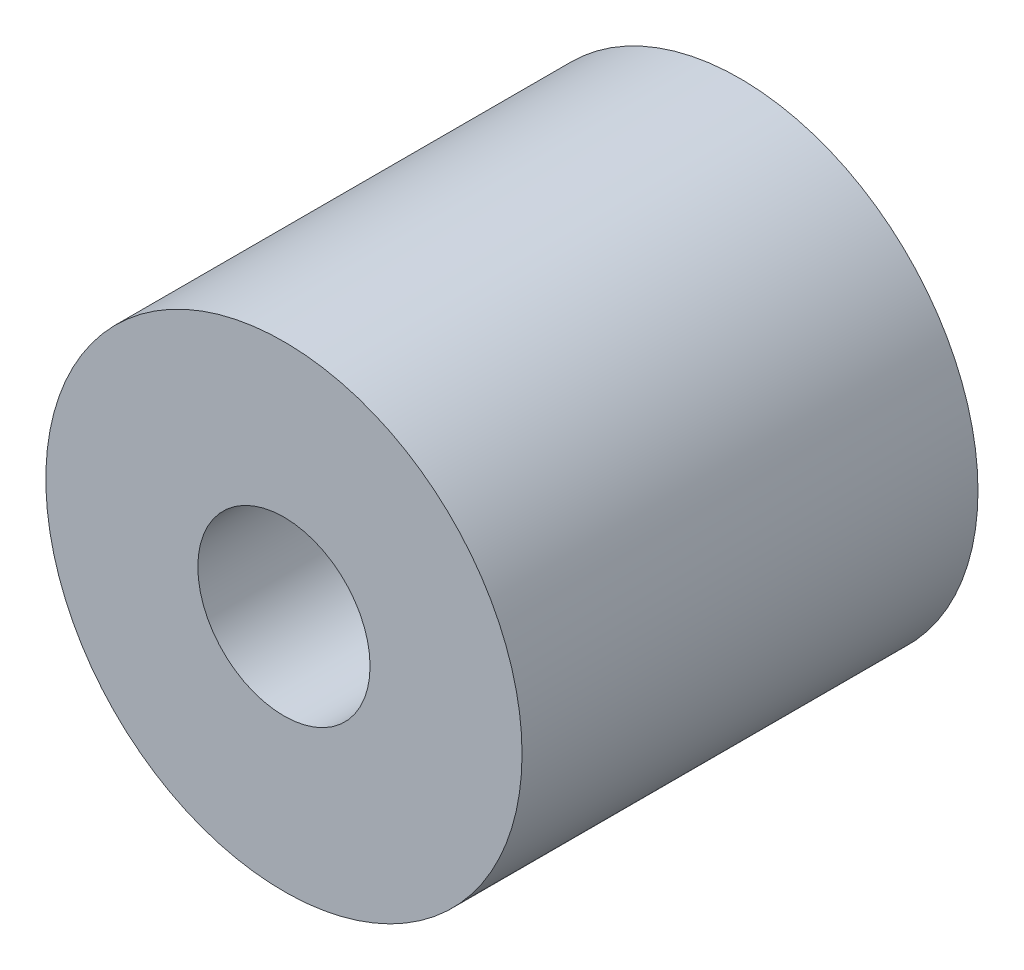
ISO-10303-21;
HEADER;
FILE_DESCRIPTION(('STEP AP214'),'2;1');
FILE_NAME('part.step','',(''),(''),'','','');
FILE_SCHEMA(('AUTOMOTIVE_DESIGN { 1 0 10303 214 1 1 1 1 }'));
ENDSEC;
DATA;
#1=APPLICATION_CONTEXT('core data for automotive mechanical design processes');
#2=APPLICATION_PROTOCOL_DEFINITION('international standard','automotive_design',2000,#1);
#3=PRODUCT_CONTEXT('',#1,'mechanical');
#4=PRODUCT('Part','Part','',(#3));
#5=PRODUCT_RELATED_PRODUCT_CATEGORY('part','',(#4));
#6=PRODUCT_DEFINITION_FORMATION('','',#4);
#7=PRODUCT_DEFINITION_CONTEXT('part definition',#1,'design');
#8=PRODUCT_DEFINITION('design','',#6,#7);
#9=PRODUCT_DEFINITION_SHAPE('','',#8);
#10=(LENGTH_UNIT() NAMED_UNIT(*) SI_UNIT(.MILLI.,.METRE.));
#11=(NAMED_UNIT(*) PLANE_ANGLE_UNIT() SI_UNIT($,.RADIAN.));
#12=(NAMED_UNIT(*) SI_UNIT($,.STERADIAN.) SOLID_ANGLE_UNIT());
#13=UNCERTAINTY_MEASURE_WITH_UNIT(LENGTH_MEASURE(1.E-05),#10,'distance_accuracy_value','');
#14=(GEOMETRIC_REPRESENTATION_CONTEXT(3) GLOBAL_UNCERTAINTY_ASSIGNED_CONTEXT((#13)) GLOBAL_UNIT_ASSIGNED_CONTEXT((#10,
#11,#12)) REPRESENTATION_CONTEXT('',''));
#15=CARTESIAN_POINT('',(0.,0.,0.));
#16=DIRECTION('',(0.,0.,1.));
#17=DIRECTION('',(1.,0.,0.));
#18=AXIS2_PLACEMENT_3D('',#15,#16,#17);
#19=CARTESIAN_POINT('',(0.,0.,9.));
#20=DIRECTION('',(0.,0.,1.));
#21=DIRECTION('',(1.,0.,0.));
#22=AXIS2_PLACEMENT_3D('',#19,#20,#21);
#23=PLANE('',#22);
#24=CARTESIAN_POINT('',(0.,0.,9.));
#25=DIRECTION('',(0.,0.,1.));
#26=DIRECTION('',(1.,0.,0.));
#27=AXIS2_PLACEMENT_3D('',#24,#25,#26);
#28=CIRCLE('',#27,4.7);
#29=CARTESIAN_POINT('',(4.7,0.,9.));
#30=VERTEX_POINT('',#29);
#31=EDGE_CURVE('E10',#30,#30,#28,.T.);
#32=ORIENTED_EDGE('',*,*,#31,.T.);
#33=EDGE_LOOP('',(#32));
#34=FACE_BOUND('',#33,.T.);
#35=CARTESIAN_POINT('',(0.,0.,9.));
#36=DIRECTION('',(0.,0.,1.));
#37=DIRECTION('',(1.,0.,0.));
#38=AXIS2_PLACEMENT_3D('',#35,#36,#37);
#39=CIRCLE('',#38,1.7);
#40=CARTESIAN_POINT('',(1.7,0.,9.));
#41=VERTEX_POINT('',#40);
#42=EDGE_CURVE('E50',#41,#41,#39,.T.);
#43=ORIENTED_EDGE('',*,*,#42,.F.);
#44=EDGE_LOOP('',(#43));
#45=FACE_BOUND('',#44,.T.);
#46=ADVANCED_FACE('F37',(#34,#45),#23,.T.);
#47=CARTESIAN_POINT('',(0.,0.,0.));
#48=DIRECTION('',(0.,0.,1.));
#49=DIRECTION('',(1.,0.,0.));
#50=AXIS2_PLACEMENT_3D('',#47,#48,#49);
#51=PLANE('',#50);
#52=CARTESIAN_POINT('',(0.,0.,0.));
#53=DIRECTION('',(0.,0.,1.));
#54=DIRECTION('',(1.,0.,0.));
#55=AXIS2_PLACEMENT_3D('',#52,#53,#54);
#56=CIRCLE('',#55,4.7);
#57=CARTESIAN_POINT('',(4.7,0.,0.));
#58=VERTEX_POINT('',#57);
#59=EDGE_CURVE('E41',#58,#58,#56,.T.);
#60=ORIENTED_EDGE('',*,*,#59,.F.);
#61=EDGE_LOOP('',(#60));
#62=FACE_BOUND('',#61,.T.);
#63=CARTESIAN_POINT('',(0.,0.,0.));
#64=DIRECTION('',(0.,0.,1.));
#65=DIRECTION('',(1.,0.,0.));
#66=AXIS2_PLACEMENT_3D('',#63,#64,#65);
#67=CIRCLE('',#66,1.7);
#68=CARTESIAN_POINT('',(1.7,0.,0.));
#69=VERTEX_POINT('',#68);
#70=EDGE_CURVE('E52',#69,#69,#67,.T.);
#71=ORIENTED_EDGE('',*,*,#70,.T.);
#72=EDGE_LOOP('',(#71));
#73=FACE_BOUND('',#72,.T.);
#74=ADVANCED_FACE('F64',(#62,#73),#51,.F.);
#75=CARTESIAN_POINT('',(0.,0.,9.));
#76=DIRECTION('',(0.,0.,-1.));
#77=DIRECTION('',(-1.,0.,0.));
#78=AXIS2_PLACEMENT_3D('',#75,#76,#77);
#79=CYLINDRICAL_SURFACE('',#78,4.7);
#80=ORIENTED_EDGE('',*,*,#31,.F.);
#81=EDGE_LOOP('',(#80));
#82=FACE_BOUND('',#81,.T.);
#83=ORIENTED_EDGE('',*,*,#59,.T.);
#84=EDGE_LOOP('',(#83));
#85=FACE_BOUND('',#84,.T.);
#86=ADVANCED_FACE('F39',(#82,#85),#79,.T.);
#87=CARTESIAN_POINT('',(0.,0.,9.));
#88=DIRECTION('',(0.,0.,-1.));
#89=DIRECTION('',(-1.,0.,0.));
#90=AXIS2_PLACEMENT_3D('',#87,#88,#89);
#91=CYLINDRICAL_SURFACE('',#90,1.7);
#92=ORIENTED_EDGE('',*,*,#42,.T.);
#93=EDGE_LOOP('',(#92));
#94=FACE_BOUND('',#93,.T.);
#95=ORIENTED_EDGE('',*,*,#70,.F.);
#96=EDGE_LOOP('',(#95));
#97=FACE_BOUND('',#96,.T.);
#98=ADVANCED_FACE('F60',(#94,#97),#91,.F.);
#99=CLOSED_SHELL('',(#46,#74,#86,#98));
#100=MANIFOLD_SOLID_BREP('B2',#99);
#101=ADVANCED_BREP_SHAPE_REPRESENTATION('',(#18,#100),#14);
#102=SHAPE_DEFINITION_REPRESENTATION(#9,#101);
ENDSEC;
END-ISO-10303-21;
